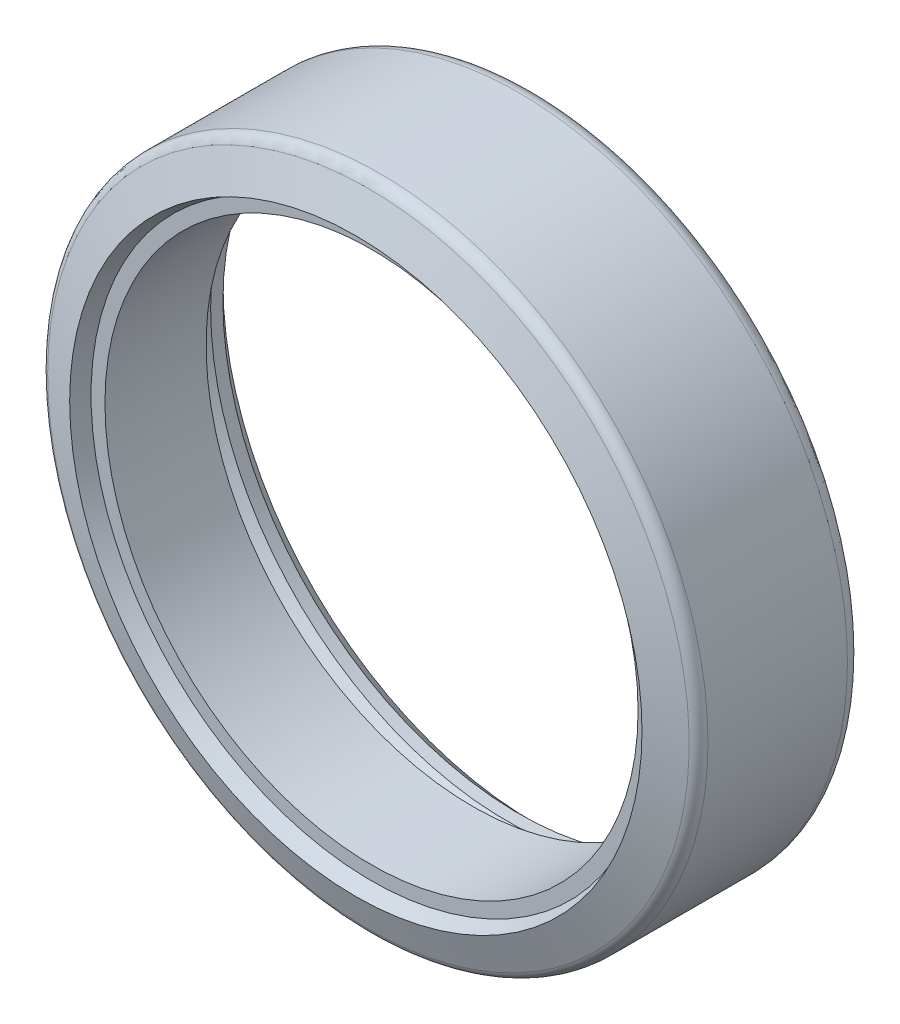
ISO-10303-21;
HEADER;
FILE_DESCRIPTION(('STEP AP214'),'2;1');
FILE_NAME('part.step','',(''),(''),'','','');
FILE_SCHEMA(('AUTOMOTIVE_DESIGN { 1 0 10303 214 1 1 1 1 }'));
ENDSEC;
DATA;
#1=APPLICATION_CONTEXT('core data for automotive mechanical design processes');
#2=APPLICATION_PROTOCOL_DEFINITION('international standard','automotive_design',2000,#1);
#3=PRODUCT_CONTEXT('',#1,'mechanical');
#4=PRODUCT('Part','Part','',(#3));
#5=PRODUCT_RELATED_PRODUCT_CATEGORY('part','',(#4));
#6=PRODUCT_DEFINITION_FORMATION('','',#4);
#7=PRODUCT_DEFINITION_CONTEXT('part definition',#1,'design');
#8=PRODUCT_DEFINITION('design','',#6,#7);
#9=PRODUCT_DEFINITION_SHAPE('','',#8);
#10=(LENGTH_UNIT() NAMED_UNIT(*) SI_UNIT(.MILLI.,.METRE.));
#11=(NAMED_UNIT(*) PLANE_ANGLE_UNIT() SI_UNIT($,.RADIAN.));
#12=(NAMED_UNIT(*) SI_UNIT($,.STERADIAN.) SOLID_ANGLE_UNIT());
#13=UNCERTAINTY_MEASURE_WITH_UNIT(LENGTH_MEASURE(1.E-05),#10,'distance_accuracy_value','');
#14=(GEOMETRIC_REPRESENTATION_CONTEXT(3) GLOBAL_UNCERTAINTY_ASSIGNED_CONTEXT((#13)) GLOBAL_UNIT_ASSIGNED_CONTEXT((#10,
#11,#12)) REPRESENTATION_CONTEXT('',''));
#15=CARTESIAN_POINT('',(0.,0.,0.));
#16=DIRECTION('',(0.,0.,1.));
#17=DIRECTION('',(1.,0.,0.));
#18=AXIS2_PLACEMENT_3D('',#15,#16,#17);
#19=CARTESIAN_POINT('',(0.,0.,-1.27));
#20=DIRECTION('',(0.,0.,1.));
#21=DIRECTION('',(0.,-1.,0.));
#22=AXIS2_PLACEMENT_3D('',#19,#20,#21);
#23=TOROIDAL_SURFACE('',#22,9.5885,0.380999999999989);
#24=CARTESIAN_POINT('',(0.,-9.9695,-1.27));
#25=VERTEX_POINT('',#24);
#26=VERTEX_LOOP('',#25);
#27=FACE_BOUND('',#26,.T.);
#28=CARTESIAN_POINT('',(0.,0.,-1.47189923967284));
#29=DIRECTION('',(0.,0.,-1.));
#30=DIRECTION('',(1.,0.,0.));
#31=AXIS2_PLACEMENT_3D('',#28,#29,#30);
#32=CIRCLE('',#31,9.9116063246356);
#33=CARTESIAN_POINT('',(9.9116063246356,0.,-1.47189923967284));
#34=VERTEX_POINT('',#33);
#35=EDGE_CURVE('E113',#34,#34,#32,.T.);
#36=ORIENTED_EDGE('',*,*,#35,.T.);
#37=EDGE_LOOP('',(#36));
#38=FACE_BOUND('',#37,.T.);
#39=CARTESIAN_POINT('',(0.,-9.57823979852446E-06,-0.889));
#40=DIRECTION('',(0.,0.,-1.));
#41=DIRECTION('',(0.999999999999501,9.98929946728058E-07,0.));
#42=AXIS2_PLACEMENT_3D('',#39,#40,#41);
#43=CIRCLE('',#42,9.58850000000478);
#44=CARTESIAN_POINT('',(9.5885,0.,-0.889));
#45=VERTEX_POINT('',#44);
#46=CARTESIAN_POINT('',(-9.5885,0.,-0.889));
#47=VERTEX_POINT('',#46);
#48=EDGE_CURVE('E24',#45,#47,#43,.T.);
#49=ORIENTED_EDGE('',*,*,#48,.F.);
#50=CARTESIAN_POINT('',(0.,2.41439958698596E-05,-0.889));
#51=DIRECTION('',(0.,0.,-1.));
#52=DIRECTION('',(-0.99999999999683,-2.51801594294171E-06,0.));
#53=AXIS2_PLACEMENT_3D('',#50,#51,#52);
#54=CIRCLE('',#53,9.5885000000304);
#55=EDGE_CURVE('E11',#47,#45,#54,.T.);
#56=ORIENTED_EDGE('',*,*,#55,.F.);
#57=EDGE_LOOP('',(#49,#56));
#58=FACE_BOUND('',#57,.T.);
#59=ADVANCED_FACE('F16',(#27,#38,#58),#23,.F.);
#60=CARTESIAN_POINT('',(0.,0.,2.38759999999994));
#61=DIRECTION('',(0.,0.,-1.));
#62=DIRECTION('',(-1.,0.,0.));
#63=AXIS2_PLACEMENT_3D('',#60,#61,#62);
#64=PLANE('',#63);
#65=CARTESIAN_POINT('',(0.,0.,2.38759999999994));
#66=DIRECTION('',(0.,0.,-1.));
#67=DIRECTION('',(-1.,0.,0.));
#68=AXIS2_PLACEMENT_3D('',#65,#66,#67);
#69=CIRCLE('',#68,8.636);
#70=CARTESIAN_POINT('',(-8.636,0.,2.38759999999994));
#71=VERTEX_POINT('',#70);
#72=EDGE_CURVE('E95',#71,#71,#69,.T.);
#73=ORIENTED_EDGE('',*,*,#72,.T.);
#74=EDGE_LOOP('',(#73));
#75=FACE_BOUND('',#74,.T.);
#76=CARTESIAN_POINT('',(0.,0.,2.38759999999994));
#77=DIRECTION('',(0.,0.,1.));
#78=DIRECTION('',(1.,0.,0.));
#79=AXIS2_PLACEMENT_3D('',#76,#77,#78);
#80=CIRCLE('',#79,9.08610312099275);
#81=CARTESIAN_POINT('',(9.08610312099275,0.,2.38759999999994));
#82=VERTEX_POINT('',#81);
#83=EDGE_CURVE('E101',#82,#82,#80,.T.);
#84=ORIENTED_EDGE('',*,*,#83,.T.);
#85=EDGE_LOOP('',(#84));
#86=FACE_BOUND('',#85,.T.);
#87=ADVANCED_FACE('F96',(#75,#86),#64,.F.);
#88=CARTESIAN_POINT('',(0.,0.,-2.8956));
#89=DIRECTION('',(0.,0.,1.));
#90=DIRECTION('',(-1.,0.,0.));
#91=AXIS2_PLACEMENT_3D('',#88,#89,#90);
#92=CYLINDRICAL_SURFACE('',#91,9.5885);
#93=CARTESIAN_POINT('',(0.,0.,-2.3876));
#94=DIRECTION('',(0.,0.,-1.));
#95=DIRECTION('',(-1.,0.,0.));
#96=AXIS2_PLACEMENT_3D('',#93,#94,#95);
#97=CIRCLE('',#96,9.5885);
#98=CARTESIAN_POINT('',(-9.5885,0.,-2.3876));
#99=VERTEX_POINT('',#98);
#100=EDGE_CURVE('E120',#99,#99,#97,.T.);
#101=ORIENTED_EDGE('',*,*,#100,.T.);
#102=EDGE_LOOP('',(#101));
#103=FACE_BOUND('',#102,.T.);
#104=CARTESIAN_POINT('',(0.,0.,-1.98897744753874));
#105=DIRECTION('',(0.,0.,-1.));
#106=DIRECTION('',(-1.,0.,0.));
#107=AXIS2_PLACEMENT_3D('',#104,#105,#106);
#108=CIRCLE('',#107,9.5885);
#109=CARTESIAN_POINT('',(-9.5885,0.,-1.98897744753874));
#110=VERTEX_POINT('',#109);
#111=EDGE_CURVE('E111',#110,#110,#108,.T.);
#112=ORIENTED_EDGE('',*,*,#111,.F.);
#113=EDGE_LOOP('',(#112));
#114=FACE_BOUND('',#113,.T.);
#115=ADVANCED_FACE('F147',(#103,#114),#92,.F.);
#116=CARTESIAN_POINT('',(0.,0.,-0.889));
#117=DIRECTION('',(0.,0.,1.));
#118=DIRECTION('',(0.,-1.,0.));
#119=AXIS2_PLACEMENT_3D('',#116,#117,#118);
#120=PLANE('',#119);
#121=CARTESIAN_POINT('',(0.,0.,-0.889));
#122=DIRECTION('',(0.,0.,1.));
#123=DIRECTION('',(1.,0.,0.));
#124=AXIS2_PLACEMENT_3D('',#121,#122,#123);
#125=CIRCLE('',#124,8.636);
#126=CARTESIAN_POINT('',(8.636,0.,-0.889));
#127=VERTEX_POINT('',#126);
#128=EDGE_CURVE('E100',#127,#127,#125,.T.);
#129=ORIENTED_EDGE('',*,*,#128,.T.);
#130=EDGE_LOOP('',(#129));
#131=FACE_BOUND('',#130,.T.);
#132=ORIENTED_EDGE('',*,*,#48,.T.);
#133=ORIENTED_EDGE('',*,*,#55,.T.);
#134=EDGE_LOOP('',(#132,#133));
#135=FACE_BOUND('',#134,.T.);
#136=ADVANCED_FACE('F139',(#131,#135),#120,.F.);
#137=CARTESIAN_POINT('',(0.,0.,3.55725));
#138=DIRECTION('',(0.,0.,1.));
#139=DIRECTION('',(0.,1.,0.));
#140=AXIS2_PLACEMENT_3D('',#137,#138,#139);
#141=CYLINDRICAL_SURFACE('',#140,8.636);
#142=ORIENTED_EDGE('',*,*,#128,.F.);
#143=EDGE_LOOP('',(#142));
#144=FACE_BOUND('',#143,.T.);
#145=ORIENTED_EDGE('',*,*,#72,.F.);
#146=EDGE_LOOP('',(#145));
#147=FACE_BOUND('',#146,.T.);
#148=ADVANCED_FACE('F172',(#144,#147),#141,.F.);
#149=CARTESIAN_POINT('',(0.,0.,2.48762224314201));
#150=DIRECTION('',(0.,0.,-1.));
#151=DIRECTION('',(-1.,0.,0.));
#152=AXIS2_PLACEMENT_3D('',#149,#150,#151);
#153=CONICAL_SURFACE('',#152,10.3919096746071,1.22173047639603);
#154=CARTESIAN_POINT('',(0.,0.,2.8956));
#155=DIRECTION('',(0.,0.,-1.));
#156=DIRECTION('',(-1.,0.,0.));
#157=AXIS2_PLACEMENT_3D('',#154,#155,#156);
#158=CIRCLE('',#157,9.271);
#159=CARTESIAN_POINT('',(-9.271,0.,2.8956));
#160=VERTEX_POINT('',#159);
#161=EDGE_CURVE('E108',#160,#160,#158,.T.);
#162=ORIENTED_EDGE('',*,*,#161,.T.);
#163=EDGE_LOOP('',(#162));
#164=FACE_BOUND('',#163,.T.);
#165=CARTESIAN_POINT('',(0.,0.,2.487622243142));
#166=DIRECTION('',(0.,0.,-1.));
#167=DIRECTION('',(-1.,0.,0.));
#168=AXIS2_PLACEMENT_3D('',#165,#166,#167);
#169=CIRCLE('',#168,10.3919096746071);
#170=CARTESIAN_POINT('',(-10.3919096746071,0.,2.487622243142));
#171=VERTEX_POINT('',#170);
#172=EDGE_CURVE('E124',#171,#171,#169,.T.);
#173=ORIENTED_EDGE('',*,*,#172,.F.);
#174=EDGE_LOOP('',(#173));
#175=FACE_BOUND('',#174,.T.);
#176=ADVANCED_FACE('F170',(#164,#175),#153,.T.);
#177=CARTESIAN_POINT('',(0.,0.,2.8956));
#178=DIRECTION('',(0.,0.,1.));
#179=DIRECTION('',(1.,0.,0.));
#180=AXIS2_PLACEMENT_3D('',#177,#178,#179);
#181=CONICAL_SURFACE('',#180,9.271,0.349065850398867);
#182=ORIENTED_EDGE('',*,*,#83,.F.);
#183=EDGE_LOOP('',(#182));
#184=FACE_BOUND('',#183,.T.);
#185=ORIENTED_EDGE('',*,*,#161,.F.);
#186=EDGE_LOOP('',(#185));
#187=FACE_BOUND('',#186,.T.);
#188=ADVANCED_FACE('F165',(#184,#187),#181,.F.);
#189=CARTESIAN_POINT('',(0.,0.,2.8956));
#190=DIRECTION('',(0.,0.,-1.));
#191=DIRECTION('',(1.,0.,0.));
#192=AXIS2_PLACEMENT_3D('',#189,#190,#191);
#193=CYLINDRICAL_SURFACE('',#192,10.6426);
#194=CARTESIAN_POINT('',(0.,0.,2.12959935462258));
#195=DIRECTION('',(0.,0.,-1.));
#196=DIRECTION('',(1.,0.,0.));
#197=AXIS2_PLACEMENT_3D('',#194,#195,#196);
#198=CIRCLE('',#197,10.6426);
#199=CARTESIAN_POINT('',(10.6426,0.,2.12959935462258));
#200=VERTEX_POINT('',#199);
#201=EDGE_CURVE('E127',#200,#200,#198,.T.);
#202=ORIENTED_EDGE('',*,*,#201,.T.);
#203=EDGE_LOOP('',(#202));
#204=FACE_BOUND('',#203,.T.);
#205=CARTESIAN_POINT('',(0.,0.,-2.3876));
#206=DIRECTION('',(0.,0.,1.));
#207=DIRECTION('',(1.,0.,0.));
#208=AXIS2_PLACEMENT_3D('',#205,#206,#207);
#209=CIRCLE('',#208,10.6426);
#210=CARTESIAN_POINT('',(10.6426,0.,-2.3876));
#211=VERTEX_POINT('',#210);
#212=EDGE_CURVE('E121',#211,#211,#209,.T.);
#213=ORIENTED_EDGE('',*,*,#212,.T.);
#214=EDGE_LOOP('',(#213));
#215=FACE_BOUND('',#214,.T.);
#216=ADVANCED_FACE('F154',(#204,#215),#193,.T.);
#217=CARTESIAN_POINT('',(0.,0.,-1.47189923967285));
#218=DIRECTION('',(0.,0.,1.));
#219=DIRECTION('',(0.,-1.,0.));
#220=AXIS2_PLACEMENT_3D('',#217,#218,#219);
#221=CONICAL_SURFACE('',#220,9.9116063246356,0.558505360638184);
#222=ORIENTED_EDGE('',*,*,#111,.T.);
#223=EDGE_LOOP('',(#222));
#224=FACE_BOUND('',#223,.T.);
#225=ORIENTED_EDGE('',*,*,#35,.F.);
#226=EDGE_LOOP('',(#225));
#227=FACE_BOUND('',#226,.T.);
#228=ADVANCED_FACE('F151',(#224,#227),#221,.F.);
#229=CARTESIAN_POINT('',(0.,0.,-2.3876));
#230=DIRECTION('',(0.,0.,-1.));
#231=DIRECTION('',(0.,1.,0.));
#232=AXIS2_PLACEMENT_3D('',#229,#230,#231);
#233=TOROIDAL_SURFACE('',#232,10.1346,0.507999999999992);
#234=ORIENTED_EDGE('',*,*,#212,.F.);
#235=EDGE_LOOP('',(#234));
#236=FACE_BOUND('',#235,.T.);
#237=CARTESIAN_POINT('',(0.,0.,-2.8956));
#238=DIRECTION('',(0.,0.,1.));
#239=DIRECTION('',(0.,-1.,0.));
#240=AXIS2_PLACEMENT_3D('',#237,#238,#239);
#241=CIRCLE('',#240,10.1346);
#242=CARTESIAN_POINT('',(0.,-10.1346,-2.8956));
#243=VERTEX_POINT('',#242);
#244=EDGE_CURVE('E114',#243,#243,#241,.T.);
#245=ORIENTED_EDGE('',*,*,#244,.T.);
#246=EDGE_LOOP('',(#245));
#247=FACE_BOUND('',#246,.T.);
#248=ADVANCED_FACE('F153',(#236,#247),#233,.T.);
#249=CARTESIAN_POINT('',(0.,0.,2.12959935462254));
#250=DIRECTION('',(0.,0.,-1.));
#251=DIRECTION('',(0.,1.,0.));
#252=AXIS2_PLACEMENT_3D('',#249,#250,#251);
#253=TOROIDAL_SURFACE('',#252,10.2616,0.381000000000023);
#254=ORIENTED_EDGE('',*,*,#172,.T.);
#255=EDGE_LOOP('',(#254));
#256=FACE_BOUND('',#255,.T.);
#257=ORIENTED_EDGE('',*,*,#201,.F.);
#258=EDGE_LOOP('',(#257));
#259=FACE_BOUND('',#258,.T.);
#260=ADVANCED_FACE('F162',(#256,#259),#253,.T.);
#261=CARTESIAN_POINT('',(0.,0.,-2.8956));
#262=DIRECTION('',(0.,0.,-1.));
#263=DIRECTION('',(-1.,0.,0.));
#264=AXIS2_PLACEMENT_3D('',#261,#262,#263);
#265=CONICAL_SURFACE('',#264,10.0965,0.785398163397448);
#266=ORIENTED_EDGE('',*,*,#100,.F.);
#267=EDGE_LOOP('',(#266));
#268=FACE_BOUND('',#267,.T.);
#269=CARTESIAN_POINT('',(0.,0.,-2.8956));
#270=DIRECTION('',(0.,0.,1.));
#271=DIRECTION('',(-1.,0.,0.));
#272=AXIS2_PLACEMENT_3D('',#269,#270,#271);
#273=CIRCLE('',#272,10.0965);
#274=CARTESIAN_POINT('',(-10.0965,0.,-2.8956));
#275=VERTEX_POINT('',#274);
#276=EDGE_CURVE('E117',#275,#275,#273,.T.);
#277=ORIENTED_EDGE('',*,*,#276,.F.);
#278=EDGE_LOOP('',(#277));
#279=FACE_BOUND('',#278,.T.);
#280=ADVANCED_FACE('F189',(#268,#279),#265,.F.);
#281=CARTESIAN_POINT('',(0.,0.,-2.8956));
#282=DIRECTION('',(0.,0.,-1.));
#283=DIRECTION('',(-1.,0.,0.));
#284=AXIS2_PLACEMENT_3D('',#281,#282,#283);
#285=PLANE('',#284);
#286=ORIENTED_EDGE('',*,*,#276,.T.);
#287=EDGE_LOOP('',(#286));
#288=FACE_BOUND('',#287,.T.);
#289=ORIENTED_EDGE('',*,*,#244,.F.);
#290=EDGE_LOOP('',(#289));
#291=FACE_BOUND('',#290,.T.);
#292=ADVANCED_FACE('F192',(#288,#291),#285,.T.);
#293=CLOSED_SHELL('',(#59,#87,#115,#136,#148,#176,#188,#216,#228,#248,#260,#280,#292));
#294=MANIFOLD_SOLID_BREP('B1',#293);
#295=ADVANCED_BREP_SHAPE_REPRESENTATION('',(#18,#294),#14);
#296=SHAPE_DEFINITION_REPRESENTATION(#9,#295);
ENDSEC;
END-ISO-10303-21;
